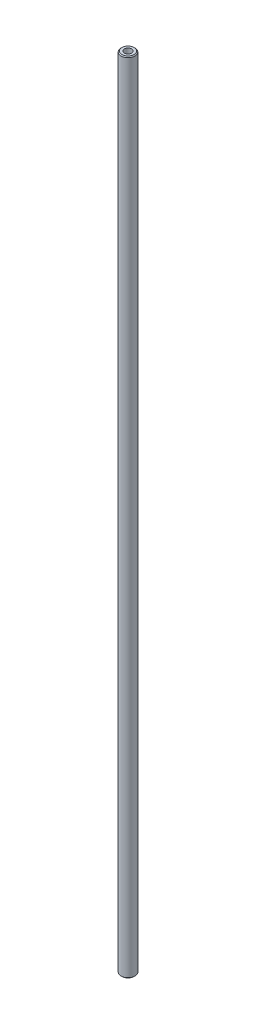
ISO-10303-21;
HEADER;
FILE_DESCRIPTION(('STEP AP214'),'2;1');
FILE_NAME('part.step','',(''),(''),'','','');
FILE_SCHEMA(('AUTOMOTIVE_DESIGN { 1 0 10303 214 1 1 1 1 }'));
ENDSEC;
DATA;
#1=APPLICATION_CONTEXT('core data for automotive mechanical design processes');
#2=APPLICATION_PROTOCOL_DEFINITION('international standard','automotive_design',2000,#1);
#3=PRODUCT_CONTEXT('',#1,'mechanical');
#4=PRODUCT('Part','Part','',(#3));
#5=PRODUCT_RELATED_PRODUCT_CATEGORY('part','',(#4));
#6=PRODUCT_DEFINITION_FORMATION('','',#4);
#7=PRODUCT_DEFINITION_CONTEXT('part definition',#1,'design');
#8=PRODUCT_DEFINITION('design','',#6,#7);
#9=PRODUCT_DEFINITION_SHAPE('','',#8);
#10=(LENGTH_UNIT() NAMED_UNIT(*) SI_UNIT(.MILLI.,.METRE.));
#11=(NAMED_UNIT(*) PLANE_ANGLE_UNIT() SI_UNIT($,.RADIAN.));
#12=(NAMED_UNIT(*) SI_UNIT($,.STERADIAN.) SOLID_ANGLE_UNIT());
#13=UNCERTAINTY_MEASURE_WITH_UNIT(LENGTH_MEASURE(1.E-05),#10,'distance_accuracy_value','');
#14=(GEOMETRIC_REPRESENTATION_CONTEXT(3) GLOBAL_UNCERTAINTY_ASSIGNED_CONTEXT((#13)) GLOBAL_UNIT_ASSIGNED_CONTEXT((#10,
#11,#12)) REPRESENTATION_CONTEXT('',''));
#15=CARTESIAN_POINT('',(0.,0.,0.));
#16=DIRECTION('',(0.,0.,1.));
#17=DIRECTION('',(1.,0.,0.));
#18=AXIS2_PLACEMENT_3D('',#15,#16,#17);
#19=CARTESIAN_POINT('',(0.,229.5,0.));
#20=DIRECTION('',(0.,-1.,0.));
#21=DIRECTION('',(0.,0.,-1.));
#22=AXIS2_PLACEMENT_3D('',#19,#20,#21);
#23=CYLINDRICAL_SURFACE('',#22,4.);
#24=CARTESIAN_POINT('',(0.,-229.,0.));
#25=DIRECTION('',(0.,1.,0.));
#26=DIRECTION('',(0.,0.,1.));
#27=AXIS2_PLACEMENT_3D('',#24,#25,#26);
#28=CIRCLE('',#27,4.);
#29=CARTESIAN_POINT('',(0.,-229.,4.));
#30=VERTEX_POINT('',#29);
#31=EDGE_CURVE('E74',#30,#30,#28,.T.);
#32=ORIENTED_EDGE('',*,*,#31,.T.);
#33=EDGE_LOOP('',(#32));
#34=FACE_BOUND('',#33,.T.);
#35=CARTESIAN_POINT('',(0.,229.,0.));
#36=DIRECTION('',(0.,1.,0.));
#37=DIRECTION('',(0.,0.,1.));
#38=AXIS2_PLACEMENT_3D('',#35,#36,#37);
#39=CIRCLE('',#38,4.);
#40=CARTESIAN_POINT('',(0.,229.,4.));
#41=VERTEX_POINT('',#40);
#42=EDGE_CURVE('E71',#41,#41,#39,.F.);
#43=ORIENTED_EDGE('',*,*,#42,.T.);
#44=EDGE_LOOP('',(#43));
#45=FACE_BOUND('',#44,.T.);
#46=ADVANCED_FACE('F36',(#34,#45),#23,.T.);
#47=CARTESIAN_POINT('',(0.,229.5,0.));
#48=DIRECTION('',(0.,1.,0.));
#49=DIRECTION('',(0.,0.,1.));
#50=AXIS2_PLACEMENT_3D('',#47,#48,#49);
#51=PLANE('',#50);
#52=CARTESIAN_POINT('',(0.,229.5,0.));
#53=DIRECTION('',(0.,1.,0.));
#54=DIRECTION('',(0.,0.,1.));
#55=AXIS2_PLACEMENT_3D('',#52,#53,#54);
#56=CIRCLE('',#55,2.09999999999999);
#57=CARTESIAN_POINT('',(0.,229.5,2.09999999999999));
#58=VERTEX_POINT('',#57);
#59=EDGE_CURVE('E60',#58,#58,#56,.T.);
#60=ORIENTED_EDGE('',*,*,#59,.F.);
#61=EDGE_LOOP('',(#60));
#62=FACE_BOUND('',#61,.T.);
#63=CARTESIAN_POINT('',(0.,229.5,0.));
#64=DIRECTION('',(0.,1.,0.));
#65=DIRECTION('',(0.,0.,1.));
#66=AXIS2_PLACEMENT_3D('',#63,#64,#65);
#67=CIRCLE('',#66,3.49999999999995);
#68=CARTESIAN_POINT('',(0.,229.5,3.49999999999995));
#69=VERTEX_POINT('',#68);
#70=EDGE_CURVE('E11',#69,#69,#67,.T.);
#71=ORIENTED_EDGE('',*,*,#70,.T.);
#72=EDGE_LOOP('',(#71));
#73=FACE_BOUND('',#72,.T.);
#74=ADVANCED_FACE('F88',(#62,#73),#51,.T.);
#75=CARTESIAN_POINT('',(0.,-229.5,0.));
#76=DIRECTION('',(0.,1.,0.));
#77=DIRECTION('',(0.,0.,1.));
#78=AXIS2_PLACEMENT_3D('',#75,#76,#77);
#79=PLANE('',#78);
#80=CARTESIAN_POINT('',(0.,-229.5,0.));
#81=DIRECTION('',(0.,-1.,0.));
#82=DIRECTION('',(0.,0.,-1.));
#83=AXIS2_PLACEMENT_3D('',#80,#81,#82);
#84=CIRCLE('',#83,2.09999999999999);
#85=CARTESIAN_POINT('',(0.,-229.5,-2.09999999999999));
#86=VERTEX_POINT('',#85);
#87=EDGE_CURVE('E61',#86,#86,#84,.T.);
#88=ORIENTED_EDGE('',*,*,#87,.F.);
#89=EDGE_LOOP('',(#88));
#90=FACE_BOUND('',#89,.T.);
#91=CARTESIAN_POINT('',(0.,-229.5,0.));
#92=DIRECTION('',(0.,1.,0.));
#93=DIRECTION('',(0.,0.,1.));
#94=AXIS2_PLACEMENT_3D('',#91,#92,#93);
#95=CIRCLE('',#94,3.50000000000006);
#96=CARTESIAN_POINT('',(0.,-229.5,3.50000000000006));
#97=VERTEX_POINT('',#96);
#98=EDGE_CURVE('E44',#97,#97,#95,.F.);
#99=ORIENTED_EDGE('',*,*,#98,.T.);
#100=EDGE_LOOP('',(#99));
#101=FACE_BOUND('',#100,.T.);
#102=ADVANCED_FACE('F79',(#90,#101),#79,.F.);
#103=CARTESIAN_POINT('',(0.,-229.,0.));
#104=DIRECTION('',(0.,1.,0.));
#105=DIRECTION('',(0.,0.,1.));
#106=AXIS2_PLACEMENT_3D('',#103,#104,#105);
#107=CONICAL_SURFACE('',#106,4.,0.7853981633975);
#108=ORIENTED_EDGE('',*,*,#98,.F.);
#109=EDGE_LOOP('',(#108));
#110=FACE_BOUND('',#109,.T.);
#111=ORIENTED_EDGE('',*,*,#31,.F.);
#112=EDGE_LOOP('',(#111));
#113=FACE_BOUND('',#112,.T.);
#114=ADVANCED_FACE('F81',(#110,#113),#107,.T.);
#115=CARTESIAN_POINT('',(0.,229.5,0.));
#116=DIRECTION('',(0.,-1.,0.));
#117=DIRECTION('',(0.,0.,-1.));
#118=AXIS2_PLACEMENT_3D('',#115,#116,#117);
#119=CONICAL_SURFACE('',#118,3.49999999999995,0.785398163397445);
#120=ORIENTED_EDGE('',*,*,#42,.F.);
#121=EDGE_LOOP('',(#120));
#122=FACE_BOUND('',#121,.T.);
#123=ORIENTED_EDGE('',*,*,#70,.F.);
#124=EDGE_LOOP('',(#123));
#125=FACE_BOUND('',#124,.T.);
#126=ADVANCED_FACE('F38',(#122,#125),#119,.T.);
#127=CARTESIAN_POINT('',(0.,205.5,0.));
#128=DIRECTION('',(0.,1.,0.));
#129=DIRECTION('',(0.,0.,1.));
#130=AXIS2_PLACEMENT_3D('',#127,#128,#129);
#131=CONICAL_SURFACE('',#130,2.09999999999999,1.02974425867664);
#132=CARTESIAN_POINT('',(0.,204.238192700042,0.));
#133=VERTEX_POINT('',#132);
#134=VERTEX_LOOP('',#133);
#135=FACE_BOUND('',#134,.T.);
#136=CARTESIAN_POINT('',(0.,205.5,0.));
#137=DIRECTION('',(0.,1.,0.));
#138=DIRECTION('',(0.,0.,1.));
#139=AXIS2_PLACEMENT_3D('',#136,#137,#138);
#140=CIRCLE('',#139,2.09999999999999);
#141=CARTESIAN_POINT('',(0.,205.5,2.09999999999999));
#142=VERTEX_POINT('',#141);
#143=EDGE_CURVE('E64',#142,#142,#140,.T.);
#144=ORIENTED_EDGE('',*,*,#143,.T.);
#145=EDGE_LOOP('',(#144));
#146=FACE_BOUND('',#145,.T.);
#147=ADVANCED_FACE('F94',(#135,#146),#131,.F.);
#148=CARTESIAN_POINT('',(0.,229.5,0.));
#149=DIRECTION('',(0.,1.,0.));
#150=DIRECTION('',(0.,0.,1.));
#151=AXIS2_PLACEMENT_3D('',#148,#149,#150);
#152=CYLINDRICAL_SURFACE('',#151,2.09999999999999);
#153=ORIENTED_EDGE('',*,*,#143,.F.);
#154=EDGE_LOOP('',(#153));
#155=FACE_BOUND('',#154,.T.);
#156=ORIENTED_EDGE('',*,*,#59,.T.);
#157=EDGE_LOOP('',(#156));
#158=FACE_BOUND('',#157,.T.);
#159=ADVANCED_FACE('F54',(#155,#158),#152,.F.);
#160=CARTESIAN_POINT('',(0.,-205.5,0.));
#161=DIRECTION('',(0.,-1.,0.));
#162=DIRECTION('',(0.,0.,-1.));
#163=AXIS2_PLACEMENT_3D('',#160,#161,#162);
#164=CONICAL_SURFACE('',#163,2.09999999999999,1.02974425867664);
#165=CARTESIAN_POINT('',(0.,-204.238192700042,0.));
#166=VERTEX_POINT('',#165);
#167=VERTEX_LOOP('',#166);
#168=FACE_BOUND('',#167,.T.);
#169=CARTESIAN_POINT('',(0.,-205.5,0.));
#170=DIRECTION('',(0.,-1.,0.));
#171=DIRECTION('',(0.,0.,-1.));
#172=AXIS2_PLACEMENT_3D('',#169,#170,#171);
#173=CIRCLE('',#172,2.09999999999999);
#174=CARTESIAN_POINT('',(0.,-205.5,-2.09999999999999));
#175=VERTEX_POINT('',#174);
#176=EDGE_CURVE('E58',#175,#175,#173,.T.);
#177=ORIENTED_EDGE('',*,*,#176,.T.);
#178=EDGE_LOOP('',(#177));
#179=FACE_BOUND('',#178,.T.);
#180=ADVANCED_FACE('F50',(#168,#179),#164,.F.);
#181=CARTESIAN_POINT('',(0.,-229.5,0.));
#182=DIRECTION('',(0.,-1.,0.));
#183=DIRECTION('',(0.,0.,-1.));
#184=AXIS2_PLACEMENT_3D('',#181,#182,#183);
#185=CYLINDRICAL_SURFACE('',#184,2.09999999999999);
#186=ORIENTED_EDGE('',*,*,#176,.F.);
#187=EDGE_LOOP('',(#186));
#188=FACE_BOUND('',#187,.T.);
#189=ORIENTED_EDGE('',*,*,#87,.T.);
#190=EDGE_LOOP('',(#189));
#191=FACE_BOUND('',#190,.T.);
#192=ADVANCED_FACE('F53',(#188,#191),#185,.F.);
#193=CLOSED_SHELL('',(#46,#74,#102,#114,#126,#147,#159,#180,#192));
#194=MANIFOLD_SOLID_BREP('B2',#193);
#195=ADVANCED_BREP_SHAPE_REPRESENTATION('',(#18,#194),#14);
#196=SHAPE_DEFINITION_REPRESENTATION(#9,#195);
ENDSEC;
END-ISO-10303-21;
